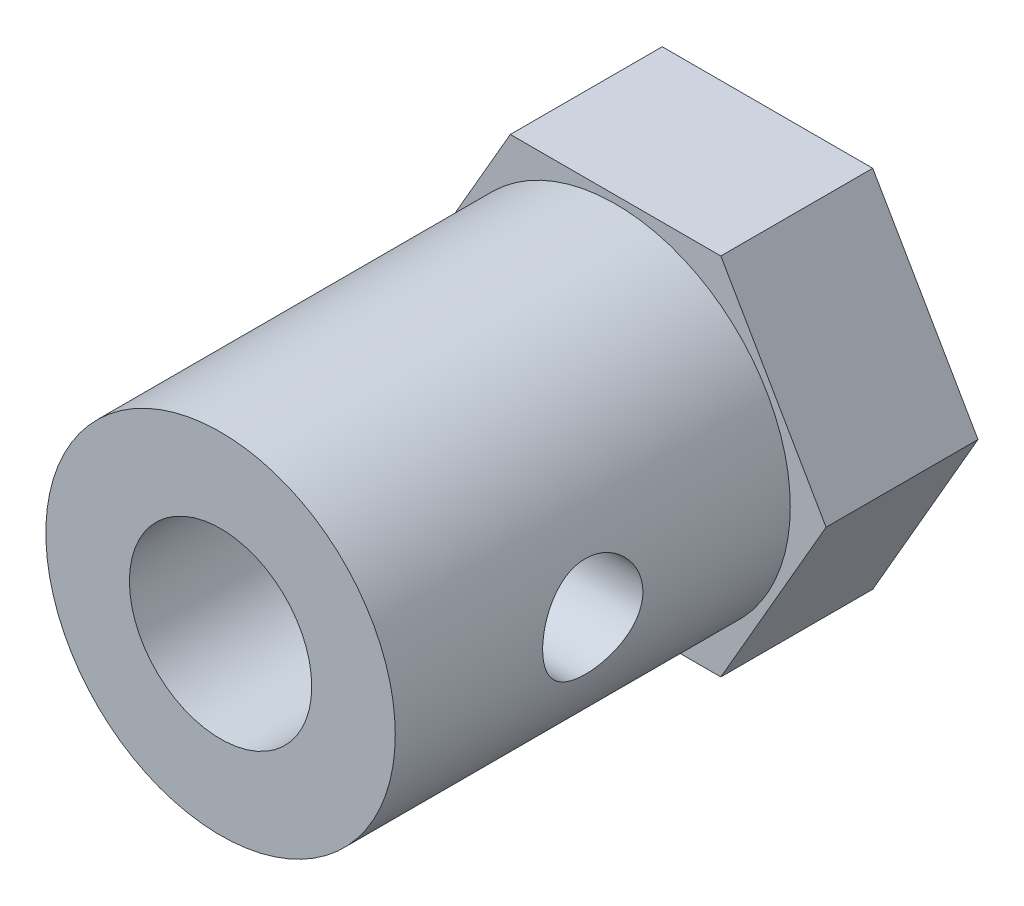
ISO-10303-21;
HEADER;
FILE_DESCRIPTION(('STEP AP214'),'2;1');
FILE_NAME('part.step','',(''),(''),'','','');
FILE_SCHEMA(('AUTOMOTIVE_DESIGN { 1 0 10303 214 1 1 1 1 }'));
ENDSEC;
DATA;
#1=APPLICATION_CONTEXT('core data for automotive mechanical design processes');
#2=APPLICATION_PROTOCOL_DEFINITION('international standard','automotive_design',2000,#1);
#3=PRODUCT_CONTEXT('',#1,'mechanical');
#4=PRODUCT('Part','Part','',(#3));
#5=PRODUCT_RELATED_PRODUCT_CATEGORY('part','',(#4));
#6=PRODUCT_DEFINITION_FORMATION('','',#4);
#7=PRODUCT_DEFINITION_CONTEXT('part definition',#1,'design');
#8=PRODUCT_DEFINITION('design','',#6,#7);
#9=PRODUCT_DEFINITION_SHAPE('','',#8);
#10=(LENGTH_UNIT() NAMED_UNIT(*) SI_UNIT(.MILLI.,.METRE.));
#11=(NAMED_UNIT(*) PLANE_ANGLE_UNIT() SI_UNIT($,.RADIAN.));
#12=(NAMED_UNIT(*) SI_UNIT($,.STERADIAN.) SOLID_ANGLE_UNIT());
#13=UNCERTAINTY_MEASURE_WITH_UNIT(LENGTH_MEASURE(1.E-05),#10,'distance_accuracy_value','');
#14=(GEOMETRIC_REPRESENTATION_CONTEXT(3) GLOBAL_UNCERTAINTY_ASSIGNED_CONTEXT((#13)) GLOBAL_UNIT_ASSIGNED_CONTEXT((#10,
#11,#12)) REPRESENTATION_CONTEXT('',''));
#15=CARTESIAN_POINT('',(0.,0.,0.));
#16=DIRECTION('',(0.,0.,1.));
#17=DIRECTION('',(1.,0.,0.));
#18=AXIS2_PLACEMENT_3D('',#15,#16,#17);
#19=CARTESIAN_POINT('',(0.,0.,18.));
#20=DIRECTION('',(0.,0.,-1.));
#21=DIRECTION('',(-1.,0.,0.));
#22=AXIS2_PLACEMENT_3D('',#19,#20,#21);
#23=CYLINDRICAL_SURFACE('',#22,5.75);
#24=CARTESIAN_POINT('',(0.,0.,18.));
#25=DIRECTION('',(0.,0.,1.));
#26=DIRECTION('',(1.,0.,0.));
#27=AXIS2_PLACEMENT_3D('',#24,#25,#26);
#28=CIRCLE('',#27,5.75);
#29=CARTESIAN_POINT('',(5.75,0.,18.));
#30=VERTEX_POINT('',#29);
#31=EDGE_CURVE('E220',#30,#30,#28,.T.);
#32=ORIENTED_EDGE('',*,*,#31,.F.);
#33=EDGE_LOOP('',(#32));
#34=FACE_BOUND('',#33,.T.);
#35=CARTESIAN_POINT('',(0.,0.,5.));
#36=DIRECTION('',(0.,0.,1.));
#37=DIRECTION('',(1.,0.,0.));
#38=AXIS2_PLACEMENT_3D('',#35,#36,#37);
#39=CIRCLE('',#38,5.75);
#40=CARTESIAN_POINT('',(5.75,0.,5.));
#41=VERTEX_POINT('',#40);
#42=EDGE_CURVE('E11',#41,#41,#39,.T.);
#43=ORIENTED_EDGE('',*,*,#42,.T.);
#44=EDGE_LOOP('',(#43));
#45=FACE_BOUND('',#44,.T.);
#46=CARTESIAN_POINT('',(5.75,0.,13.15));
#47=CARTESIAN_POINT('',(5.74999894485586,-0.0906961446381819,13.1499984405625));
#48=CARTESIAN_POINT('',(5.7478333791731,-0.181408288549587,13.1424970899451));
#49=CARTESIAN_POINT('',(5.73940553693281,-0.360202358944356,13.1127537315581));
#50=CARTESIAN_POINT('',(5.73314173825162,-0.448283295456844,13.0905062468906));
#51=CARTESIAN_POINT('',(5.71720581243595,-0.619209546256528,13.0320662575807));
#52=CARTESIAN_POINT('',(5.70753846268217,-0.702062008228269,12.9958932927651));
#53=CARTESIAN_POINT('',(5.68580699621906,-0.86052535142575,12.9107062228644));
#54=CARTESIAN_POINT('',(5.67374262283993,-0.936135455864288,12.8616907424422));
#55=CARTESIAN_POINT('',(5.64815284445102,-1.07997125627182,12.7508402700159));
#56=CARTESIAN_POINT('',(5.63459945629327,-1.14797782499046,12.6887274134066));
#57=CARTESIAN_POINT('',(5.60773116392039,-1.2727663228433,12.5540382389217));
#58=CARTESIAN_POINT('',(5.59441629610124,-1.3295465519892,12.4814603392129));
#59=CARTESIAN_POINT('',(5.56924061927724,-1.43138911178981,12.3260898327616));
#60=CARTESIAN_POINT('',(5.55741480657287,-1.47619022690635,12.2431198053084));
#61=CARTESIAN_POINT('',(5.53697172829493,-1.55111673219442,12.0704298045356));
#62=CARTESIAN_POINT('',(5.5283537658123,-1.58124531043008,11.980711302427));
#63=CARTESIAN_POINT('',(5.51559267171438,-1.62519308311781,11.7995186717094));
#64=CARTESIAN_POINT('',(5.51133965574286,-1.63941362793417,11.7081498282951));
#65=CARTESIAN_POINT('',(5.50746251461453,-1.6523941928162,11.5242319114202));
#66=CARTESIAN_POINT('',(5.50783737395267,-1.6511576046744,11.4316831013349));
#67=CARTESIAN_POINT('',(5.51307584933829,-1.63357560770256,11.2512419023816));
#68=CARTESIAN_POINT('',(5.51779218531269,-1.61772590568747,11.1632962400759));
#69=CARTESIAN_POINT('',(5.53094492411859,-1.57216567611317,10.9913685029092));
#70=CARTESIAN_POINT('',(5.53938166587569,-1.54245388571593,10.9073867899322));
#71=CARTESIAN_POINT('',(5.55914691967904,-1.46963231247883,10.7445263968793));
#72=CARTESIAN_POINT('',(5.57051092684131,-1.42635655158543,10.6657264233927));
#73=CARTESIAN_POINT('',(5.59483240379385,-1.32775098223681,10.5163374683174));
#74=CARTESIAN_POINT('',(5.60779023075596,-1.27241846973636,10.4457503341314));
#75=CARTESIAN_POINT('',(5.63444304543033,-1.14877872986672,10.3119705726714));
#76=CARTESIAN_POINT('',(5.64814732630681,-1.08005808628069,10.2491612679456));
#77=CARTESIAN_POINT('',(5.67431013521396,-0.932889263263325,10.135873537644));
#78=CARTESIAN_POINT('',(5.68676859753998,-0.854440571261456,10.0853957622327));
#79=CARTESIAN_POINT('',(5.70913392660977,-0.689387714677584,9.99799756735523));
#80=CARTESIAN_POINT('',(5.71902589074793,-0.602739737447879,9.96115582209669));
#81=CARTESIAN_POINT('',(5.73503628097883,-0.424129180421753,9.90267769185267));
#82=CARTESIAN_POINT('',(5.74115566675719,-0.332167958748287,9.88103743964685));
#83=CARTESIAN_POINT('',(5.74878229269431,-0.148805120715148,9.85420000916309));
#84=CARTESIAN_POINT('',(5.75043537624892,-0.0574855851111882,9.84848268174512));
#85=CARTESIAN_POINT('',(5.74936754798713,0.124810947541473,9.85220416305477));
#86=CARTESIAN_POINT('',(5.7466471659855,0.215787984743228,9.86164113594473));
#87=CARTESIAN_POINT('',(5.7372330855778,0.392896948063371,9.89498007817756));
#88=CARTESIAN_POINT('',(5.73062139395372,0.479089803046606,9.91858369234823));
#89=CARTESIAN_POINT('',(5.71418299265245,0.646277939031781,9.97923200530588));
#90=CARTESIAN_POINT('',(5.70435590980621,0.72727261544237,10.016278264262));
#91=CARTESIAN_POINT('',(5.68224574402977,0.88372270661621,10.1036700289363));
#92=CARTESIAN_POINT('',(5.66991383217279,0.95901905985284,10.1542876123503));
#93=CARTESIAN_POINT('',(5.6442144676031,1.10022857486026,10.2670501025528));
#94=CARTESIAN_POINT('',(5.63084677766897,1.16613957726298,10.3291976545898));
#95=CARTESIAN_POINT('',(5.60403174928982,1.28895901420806,10.4656947166757));
#96=CARTESIAN_POINT('',(5.59059635182993,1.34549838779868,10.5403793334319));
#97=CARTESIAN_POINT('',(5.56564246336,1.44526055924657,10.6984663577108));
#98=CARTESIAN_POINT('',(5.55412390685278,1.48848381214969,10.7818684672039));
#99=CARTESIAN_POINT('',(5.53444235202912,1.56007293905557,10.9546830720141));
#100=CARTESIAN_POINT('',(5.52626177491665,1.5885168680396,11.0440611180019));
#101=CARTESIAN_POINT('',(5.51420547135784,1.62988071124704,11.2266124631843));
#102=CARTESIAN_POINT('',(5.5103284262893,1.64280538074285,11.3197845907787));
#103=CARTESIAN_POINT('',(5.5074402742898,1.65245987251955,11.5034685465837));
#104=CARTESIAN_POINT('',(5.50824947335189,1.64978772302246,11.5939465508489));
#105=CARTESIAN_POINT('',(5.51421515076883,1.62973566438414,11.7731043332403));
#106=CARTESIAN_POINT('',(5.51937148168594,1.61235625405569,11.8617841722488));
#107=CARTESIAN_POINT('',(5.53333519378014,1.56375384907016,12.0339420216163));
#108=CARTESIAN_POINT('',(5.54210412419185,1.53267641313955,12.1174644697843));
#109=CARTESIAN_POINT('',(5.56230093904094,1.45767276307374,12.2781758153731));
#110=CARTESIAN_POINT('',(5.57372929738854,1.41374425851812,12.355363580633));
#111=CARTESIAN_POINT('',(5.59843739640016,1.31255246555541,12.5040220733673));
#112=CARTESIAN_POINT('',(5.61176649295712,1.25489022721241,12.5752130466321));
#113=CARTESIAN_POINT('',(5.63852078233132,1.12860221455032,12.7071023963313));
#114=CARTESIAN_POINT('',(5.65194599855773,1.05997367626547,12.7677981194728));
#115=CARTESIAN_POINT('',(5.67779722780504,0.91155408964373,12.8785359123087));
#116=CARTESIAN_POINT('',(5.69018826682081,0.831519570391585,12.9282606136112));
#117=CARTESIAN_POINT('',(5.71217142304035,0.663871191007069,13.0134746702933));
#118=CARTESIAN_POINT('',(5.72176505050729,0.576261453823037,13.0489717107773));
#119=CARTESIAN_POINT('',(5.73606952160004,0.40769083978903,13.1009467332427));
#120=CARTESIAN_POINT('',(5.74125239799259,0.327342194635824,13.1192948467815));
#121=CARTESIAN_POINT('',(5.7482178842134,0.164666580993481,13.1438213579009));
#122=CARTESIAN_POINT('',(5.75000095792876,0.0823398839526751,13.1500014157592));
#123=CARTESIAN_POINT('',(5.75,0.,13.15));
#124=B_SPLINE_CURVE_WITH_KNOTS('',3,(#46,#47,#48,#49,#50,#51,#52,#53,#54,#55,#56,#57,#58,#59,
#60,#61,#62,#63,#64,#65,#66,#67,#68,#69,#70,#71,#72,#73,#74,#75,#76,#77,#78,#79,#80,#81,#82,#83,
#84,#85,#86,#87,#88,#89,#90,#91,#92,#93,#94,#95,#96,#97,#98,#99,#100,#101,#102,#103,#104,#105,
#106,#107,#108,#109,#110,#111,#112,#113,#114,#115,#116,#117,#118,#119,#120,#121,#122,#123),
.UNSPECIFIED.,.T.,.F.,(4,2,2,2,2,2,2,2,2,2,2,2,2,2,2,2,2,2,2,2,2,2,2,2,2,2,2,2,2,2,2,2,2,2,2,2,
2,2,4),(0.,0.271786181811191,0.543673365004665,0.815180426461545,1.08671657618187,
1.36472887245395,1.64278323553499,1.92648098453513,2.21011706385886,2.48642335418865,
2.76266901508852,3.02987551217674,3.29710635656585,3.56774404904759,3.83844250177548,
4.11943605412332,4.40044441830765,4.68304970328904,4.96558306815811,5.23877224528155,
5.51192832994056,5.77952413512242,6.04715100772602,6.32060664877917,6.59412510480543,
6.87667374860184,7.15921273591808,7.44024396372968,7.72118905847898,7.991434465033,
8.26167070628679,8.52910208965749,8.79658116586061,9.07306028653828,9.34960920173971,
9.63333523109917,9.91690779797436,10.1636867198652,10.4104319675221),.UNSPECIFIED.);
#125=CARTESIAN_POINT('',(5.75,0.,13.15));
#126=VERTEX_POINT('',#125);
#127=EDGE_CURVE('E164',#126,#126,#124,.T.);
#128=ORIENTED_EDGE('',*,*,#127,.F.);
#129=EDGE_LOOP('',(#128));
#130=FACE_BOUND('',#129,.T.);
#131=CARTESIAN_POINT('',(-5.75,0.,13.15));
#132=CARTESIAN_POINT('',(-5.74999894485586,0.0906961446381819,13.1499984405625));
#133=CARTESIAN_POINT('',(-5.7478333791731,0.181408288549587,13.1424970899451));
#134=CARTESIAN_POINT('',(-5.73940553693281,0.360202358944356,13.1127537315581));
#135=CARTESIAN_POINT('',(-5.73314173825162,0.448283295456844,13.0905062468906));
#136=CARTESIAN_POINT('',(-5.71720581243595,0.619209546256528,13.0320662575807));
#137=CARTESIAN_POINT('',(-5.70753846268218,0.702062008228269,12.9958932927651));
#138=CARTESIAN_POINT('',(-5.68580699621906,0.86052535142575,12.9107062228644));
#139=CARTESIAN_POINT('',(-5.67374262283993,0.936135455864288,12.8616907424422));
#140=CARTESIAN_POINT('',(-5.64815284445101,1.07997125627182,12.7508402700159));
#141=CARTESIAN_POINT('',(-5.63459945629327,1.14797782499046,12.6887274134066));
#142=CARTESIAN_POINT('',(-5.60773116392039,1.2727663228433,12.5540382389217));
#143=CARTESIAN_POINT('',(-5.59441629610124,1.3295465519892,12.4814603392129));
#144=CARTESIAN_POINT('',(-5.56924061927724,1.43138911178981,12.3260898327616));
#145=CARTESIAN_POINT('',(-5.55741480657287,1.47619022690635,12.2431198053084));
#146=CARTESIAN_POINT('',(-5.53697172829493,1.55111673219442,12.0704298045356));
#147=CARTESIAN_POINT('',(-5.5283537658123,1.58124531043008,11.980711302427));
#148=CARTESIAN_POINT('',(-5.51559267171438,1.62519308311781,11.7995186717094));
#149=CARTESIAN_POINT('',(-5.51133965574286,1.63941362793417,11.7081498282951));
#150=CARTESIAN_POINT('',(-5.50746251461453,1.65239419281619,11.5242319114202));
#151=CARTESIAN_POINT('',(-5.50783737395267,1.6511576046744,11.4316831013349));
#152=CARTESIAN_POINT('',(-5.51307584933829,1.63357560770256,11.2512419023816));
#153=CARTESIAN_POINT('',(-5.51779218531269,1.61772590568747,11.1632962400759));
#154=CARTESIAN_POINT('',(-5.53094492411859,1.57216567611317,10.9913685029092));
#155=CARTESIAN_POINT('',(-5.53938166587569,1.54245388571593,10.9073867899322));
#156=CARTESIAN_POINT('',(-5.55914691967904,1.46963231247883,10.7445263968793));
#157=CARTESIAN_POINT('',(-5.57051092684131,1.42635655158543,10.6657264233927));
#158=CARTESIAN_POINT('',(-5.59483240379385,1.32775098223681,10.5163374683174));
#159=CARTESIAN_POINT('',(-5.60779023075596,1.27241846973636,10.4457503341314));
#160=CARTESIAN_POINT('',(-5.63444304543033,1.14877872986672,10.3119705726714));
#161=CARTESIAN_POINT('',(-5.64814732630681,1.08005808628069,10.2491612679456));
#162=CARTESIAN_POINT('',(-5.67431013521396,0.932889263263325,10.135873537644));
#163=CARTESIAN_POINT('',(-5.68676859753998,0.854440571261455,10.0853957622327));
#164=CARTESIAN_POINT('',(-5.70913392660977,0.689387714677585,9.99799756735523));
#165=CARTESIAN_POINT('',(-5.71902589074793,0.60273973744788,9.96115582209669));
#166=CARTESIAN_POINT('',(-5.73503628097883,0.424129180421754,9.90267769185267));
#167=CARTESIAN_POINT('',(-5.74115566675719,0.332167958748289,9.88103743964685));
#168=CARTESIAN_POINT('',(-5.74878229269431,0.148805120715149,9.85420000916309));
#169=CARTESIAN_POINT('',(-5.75043537624892,0.0574855851111898,9.84848268174512));
#170=CARTESIAN_POINT('',(-5.74936754798713,-0.124810947541471,9.85220416305477));
#171=CARTESIAN_POINT('',(-5.7466471659855,-0.215787984743227,9.86164113594473));
#172=CARTESIAN_POINT('',(-5.7372330855778,-0.39289694806337,9.89498007817756));
#173=CARTESIAN_POINT('',(-5.73062139395372,-0.479089803046605,9.91858369234823));
#174=CARTESIAN_POINT('',(-5.71418299265245,-0.646277939031781,9.97923200530588));
#175=CARTESIAN_POINT('',(-5.70435590980621,-0.72727261544237,10.016278264262));
#176=CARTESIAN_POINT('',(-5.68224574402977,-0.883722706616209,10.1036700289363));
#177=CARTESIAN_POINT('',(-5.66991383217279,-0.959019059852839,10.1542876123503));
#178=CARTESIAN_POINT('',(-5.6442144676031,-1.10022857486026,10.2670501025528));
#179=CARTESIAN_POINT('',(-5.63084677766897,-1.16613957726298,10.3291976545898));
#180=CARTESIAN_POINT('',(-5.60403174928982,-1.28895901420806,10.4656947166757));
#181=CARTESIAN_POINT('',(-5.59059635182993,-1.34549838779868,10.5403793334319));
#182=CARTESIAN_POINT('',(-5.56564246336,-1.44526055924657,10.6984663577108));
#183=CARTESIAN_POINT('',(-5.55412390685278,-1.48848381214969,10.7818684672039));
#184=CARTESIAN_POINT('',(-5.53444235202911,-1.56007293905557,10.9546830720141));
#185=CARTESIAN_POINT('',(-5.52626177491665,-1.5885168680396,11.0440611180019));
#186=CARTESIAN_POINT('',(-5.51420547135784,-1.62988071124704,11.2266124631843));
#187=CARTESIAN_POINT('',(-5.5103284262893,-1.64280538074285,11.3197845907787));
#188=CARTESIAN_POINT('',(-5.5074402742898,-1.65245987251955,11.5034685465837));
#189=CARTESIAN_POINT('',(-5.50824947335189,-1.64978772302246,11.5939465508489));
#190=CARTESIAN_POINT('',(-5.51421515076883,-1.62973566438414,11.7731043332403));
#191=CARTESIAN_POINT('',(-5.51937148168594,-1.61235625405569,11.8617841722488));
#192=CARTESIAN_POINT('',(-5.53333519378014,-1.56375384907016,12.0339420216163));
#193=CARTESIAN_POINT('',(-5.54210412419185,-1.53267641313955,12.1174644697843));
#194=CARTESIAN_POINT('',(-5.56230093904094,-1.45767276307374,12.2781758153731));
#195=CARTESIAN_POINT('',(-5.57372929738854,-1.41374425851812,12.355363580633));
#196=CARTESIAN_POINT('',(-5.59843739640016,-1.31255246555541,12.5040220733673));
#197=CARTESIAN_POINT('',(-5.61176649295712,-1.25489022721241,12.5752130466321));
#198=CARTESIAN_POINT('',(-5.63852078233132,-1.12860221455032,12.7071023963313));
#199=CARTESIAN_POINT('',(-5.65194599855773,-1.05997367626547,12.7677981194728));
#200=CARTESIAN_POINT('',(-5.67779722780504,-0.91155408964373,12.8785359123087));
#201=CARTESIAN_POINT('',(-5.69018826682081,-0.831519570391585,12.9282606136112));
#202=CARTESIAN_POINT('',(-5.71217142304035,-0.663871191007069,13.0134746702933));
#203=CARTESIAN_POINT('',(-5.72176505050729,-0.576261453823037,13.0489717107773));
#204=CARTESIAN_POINT('',(-5.73606952160004,-0.40769083978903,13.1009467332427));
#205=CARTESIAN_POINT('',(-5.74125239799258,-0.327342194635824,13.1192948467815));
#206=CARTESIAN_POINT('',(-5.7482178842134,-0.164666580993481,13.1438213579009));
#207=CARTESIAN_POINT('',(-5.75000095792876,-0.0823398839526751,13.1500014157592));
#208=CARTESIAN_POINT('',(-5.75,0.,13.15));
#209=B_SPLINE_CURVE_WITH_KNOTS('',3,(#131,#132,#133,#134,#135,#136,#137,#138,#139,#140,#141,
#142,#143,#144,#145,#146,#147,#148,#149,#150,#151,#152,#153,#154,#155,#156,#157,#158,#159,#160,
#161,#162,#163,#164,#165,#166,#167,#168,#169,#170,#171,#172,#173,#174,#175,#176,#177,#178,#179,
#180,#181,#182,#183,#184,#185,#186,#187,#188,#189,#190,#191,#192,#193,#194,#195,#196,#197,#198,
#199,#200,#201,#202,#203,#204,#205,#206,#207,#208),.UNSPECIFIED.,.T.,.F.,(4,2,2,2,2,2,2,2,2,2,2,
2,2,2,2,2,2,2,2,2,2,2,2,2,2,2,2,2,2,2,2,2,2,2,2,2,2,2,4),(0.,0.271786181811191,
0.543673365004665,0.815180426461545,1.08671657618187,1.36472887245394,1.64278323553499,
1.92648098453513,2.21011706385886,2.48642335418865,2.76266901508852,3.02987551217674,
3.29710635656585,3.56774404904759,3.83844250177548,4.11943605412332,4.40044441830765,
4.68304970328904,4.96558306815811,5.23877224528154,5.51192832994056,5.77952413512242,
6.04715100772602,6.32060664877917,6.59412510480542,6.87667374860184,7.15921273591808,
7.44024396372968,7.72118905847898,7.991434465033,8.26167070628679,8.52910208965749,
8.79658116586061,9.07306028653828,9.34960920173971,9.63333523109917,9.91690779797435,
10.1636867198652,10.4104319675221),.UNSPECIFIED.);
#210=CARTESIAN_POINT('',(-5.75,0.,13.15));
#211=VERTEX_POINT('',#210);
#212=EDGE_CURVE('E170',#211,#211,#209,.T.);
#213=ORIENTED_EDGE('',*,*,#212,.F.);
#214=EDGE_LOOP('',(#213));
#215=FACE_BOUND('',#214,.T.);
#216=ADVANCED_FACE('F35',(#34,#45,#130,#215),#23,.T.);
#217=CARTESIAN_POINT('',(0.,0.,18.));
#218=DIRECTION('',(0.,0.,-1.));
#219=DIRECTION('',(-1.,0.,0.));
#220=AXIS2_PLACEMENT_3D('',#217,#218,#219);
#221=CYLINDRICAL_SURFACE('',#220,3.);
#222=CARTESIAN_POINT('',(3.,0.,13.15));
#223=CARTESIAN_POINT('',(2.99999513886583,-0.0856699475452995,13.1499946166217));
#224=CARTESIAN_POINT('',(2.99629302255545,-0.171409071205646,13.143289354409));
#225=CARTESIAN_POINT('',(2.9818478399119,-0.340286051726047,13.1167977847696));
#226=CARTESIAN_POINT('',(2.97109516282085,-0.423420195379861,13.096993621652));
#227=CARTESIAN_POINT('',(2.9436571869529,-0.584401577928637,13.0453455356783));
#228=CARTESIAN_POINT('',(2.9269963495649,-0.662269062667419,13.0135512213703));
#229=CARTESIAN_POINT('',(2.8892116252981,-0.811408240635763,12.9391213318261));
#230=CARTESIAN_POINT('',(2.86808754775153,-0.882679651896674,12.8964852934199));
#231=CARTESIAN_POINT('',(2.82153252993505,-1.02211619357275,12.7982846668754));
#232=CARTESIAN_POINT('',(2.79590528013301,-1.08973037342791,12.7420324755559));
#233=CARTESIAN_POINT('',(2.74375354722835,-1.21508634233517,12.6197083915399));
#234=CARTESIAN_POINT('',(2.71722825277821,-1.2728189023456,12.5536274256305));
#235=CARTESIAN_POINT('',(2.66321895829991,-1.38251917690996,12.4057740140773));
#236=CARTESIAN_POINT('',(2.635897965792,-1.43335857713386,12.3230970385153));
#237=CARTESIAN_POINT('',(2.58678336476683,-1.52021547735939,12.1487726343674));
#238=CARTESIAN_POINT('',(2.56498539395023,-1.5562446891168,12.0571323651428));
#239=CARTESIAN_POINT('',(2.53163475086558,-1.60989890926138,11.8732305515727));
#240=CARTESIAN_POINT('',(2.51952192354843,-1.62854263347079,11.7813738465472));
#241=CARTESIAN_POINT('',(2.5055890563389,-1.64991120631134,11.5951105514433));
#242=CARTESIAN_POINT('',(2.50375425894471,-1.65265887915297,11.500707812976));
#243=CARTESIAN_POINT('',(2.51015646726158,-1.64290000078864,11.3275716432504));
#244=CARTESIAN_POINT('',(2.51690299364892,-1.63265157443424,11.2486402415007));
#245=CARTESIAN_POINT('',(2.53703527550373,-1.60118639026894,11.0938705800967));
#246=CARTESIAN_POINT('',(2.55042405491467,-1.5799646365691,11.0180337463059));
#247=CARTESIAN_POINT('',(2.58256130946142,-1.52687641342515,10.8695176799991));
#248=CARTESIAN_POINT('',(2.60141910516922,-1.49479033069661,10.7969417622077));
#249=CARTESIAN_POINT('',(2.64240902469132,-1.42107429999088,10.6578289794032));
#250=CARTESIAN_POINT('',(2.66454256035721,-1.37944023253661,10.5912947384181));
#251=CARTESIAN_POINT('',(2.71379040847906,-1.28018349411555,10.4551052164199));
#252=CARTESIAN_POINT('',(2.74113957142577,-1.22107458392543,10.3866139481156));
#253=CARTESIAN_POINT('',(2.79497377887706,-1.09224532196501,10.2599734193486));
#254=CARTESIAN_POINT('',(2.82145822218593,-1.02251777065964,10.2018312341076));
#255=CARTESIAN_POINT('',(2.87272134052732,-0.868605041800936,10.0937851733166));
#256=CARTESIAN_POINT('',(2.89726648156192,-0.783763861453043,10.0446953593711));
#257=CARTESIAN_POINT('',(2.93971528365153,-0.605352377645233,9.96191924656253));
#258=CARTESIAN_POINT('',(2.95762518579738,-0.511790381195994,9.92821846583331));
#259=CARTESIAN_POINT('',(2.98333345624201,-0.327907037980979,9.88038778956176));
#260=CARTESIAN_POINT('',(2.99191822782612,-0.238095480523289,9.86472744848248));
#261=CARTESIAN_POINT('',(3.00083376662002,-0.0567325334425141,9.84846917129306));
#262=CARTESIAN_POINT('',(3.00116980828416,0.0348177069344338,9.84786161003821));
#263=CARTESIAN_POINT('',(2.99394177831786,0.207487375150857,9.86103451330555));
#264=CARTESIAN_POINT('',(2.98714659587173,0.288751776237439,9.87341460128179));
#265=CARTESIAN_POINT('',(2.96746793830126,0.447838849624848,9.90984259733264));
#266=CARTESIAN_POINT('',(2.95458384737082,0.52566117293791,9.93389168556646));
#267=CARTESIAN_POINT('',(2.92349378037744,0.677753407865903,9.99335761595169));
#268=CARTESIAN_POINT('',(2.90517475144826,0.751904240945377,10.0290176955469));
#269=CARTESIAN_POINT('',(2.86484215103297,0.893363199749703,10.1103713462997));
#270=CARTESIAN_POINT('',(2.8428272299655,0.960668811424107,10.1560685844836));
#271=CARTESIAN_POINT('',(2.79420331593949,1.09455456288909,10.2620447141384));
#272=CARTESIAN_POINT('',(2.76735592347542,1.16021004375818,10.323383283659));
#273=CARTESIAN_POINT('',(2.71365440736755,1.28079913012788,10.4559244296775));
#274=CARTESIAN_POINT('',(2.6868003055646,1.33572155748717,10.5271371592824));
#275=CARTESIAN_POINT('',(2.63385875511374,1.43747254066661,10.6841641934071));
#276=CARTESIAN_POINT('',(2.60799295737883,1.48334076829298,10.7706830768754));
#277=CARTESIAN_POINT('',(2.56323063992907,1.55942876653783,10.9519940797087));
#278=CARTESIAN_POINT('',(2.54432398053561,1.58967133039468,11.0467739113999));
#279=CARTESIAN_POINT('',(2.51825420457375,1.6306246255404,11.2322623775855));
#280=CARTESIAN_POINT('',(2.51013022153208,1.64294477567078,11.3224747805395));
#281=CARTESIAN_POINT('',(2.50386093509844,1.6524903491229,11.504010469288));
#282=CARTESIAN_POINT('',(2.50570706604924,1.64972872967261,11.5953327342726));
#283=CARTESIAN_POINT('',(2.51807870697285,1.63075691736925,11.7632195215555));
#284=CARTESIAN_POINT('',(2.52738874118223,1.61642825416935,11.8401009735331));
#285=CARTESIAN_POINT('',(2.55192145753237,1.57741079979876,11.99019541896));
#286=CARTESIAN_POINT('',(2.56714656833463,1.55271775279779,12.0634068916));
#287=CARTESIAN_POINT('',(2.60289749299613,1.492056117962,12.209139646293));
#288=CARTESIAN_POINT('',(2.62369085726804,1.45548954002739,12.2813439958992));
#289=CARTESIAN_POINT('',(2.66794671801683,1.37268509596929,12.4190760215003));
#290=CARTESIAN_POINT('',(2.69141062791391,1.32644209751913,12.4846001267867));
#291=CARTESIAN_POINT('',(2.74276036037727,1.21715006880685,12.6178497395553));
#292=CARTESIAN_POINT('',(2.770762457364,1.15260264369497,12.6843082351833));
#293=CARTESIAN_POINT('',(2.82486614857147,1.01279351012944,12.8058844274221));
#294=CARTESIAN_POINT('',(2.85096636964491,0.937524174112386,12.860993981549));
#295=CARTESIAN_POINT('',(2.89948189270181,0.774887264813826,12.9599380339659));
#296=CARTESIAN_POINT('',(2.92173740350452,0.68718989241559,13.0033135644064));
#297=CARTESIAN_POINT('',(2.95878417900051,0.504223640414895,13.0741097143307));
#298=CARTESIAN_POINT('',(2.97359457153256,0.408974898948851,13.1015712477707));
#299=CARTESIAN_POINT('',(2.98911434756595,0.260510618519073,13.1301420580123));
#300=CARTESIAN_POINT('',(2.99318008334623,0.208783056433922,13.1375724320123));
#301=CARTESIAN_POINT('',(2.99862437594613,0.104712273399593,13.1475030128209));
#302=CARTESIAN_POINT('',(3.00000297155585,0.0523690613485743,13.1500032907977));
#303=CARTESIAN_POINT('',(3.,0.,13.15));
#304=B_SPLINE_CURVE_WITH_KNOTS('',3,(#222,#223,#224,#225,#226,#227,#228,#229,#230,#231,#232,
#233,#234,#235,#236,#237,#238,#239,#240,#241,#242,#243,#244,#245,#246,#247,#248,#249,#250,#251,
#252,#253,#254,#255,#256,#257,#258,#259,#260,#261,#262,#263,#264,#265,#266,#267,#268,#269,#270,
#271,#272,#273,#274,#275,#276,#277,#278,#279,#280,#281,#282,#283,#284,#285,#286,#287,#288,#289,
#290,#291,#292,#293,#294,#295,#296,#297,#298,#299,#300,#301,#302,#303),.UNSPECIFIED.,.T.,.F.,(4,
2,2,2,2,2,2,2,2,2,2,2,2,2,2,2,2,2,2,2,2,2,2,2,2,2,2,2,2,2,2,2,2,2,2,2,2,2,2,2,4),(0.,
0.256799016537927,0.513948810602823,0.770046131883809,1.02615439574975,1.29988051794781,
1.57386091081864,1.87483382859252,2.17556827984511,2.45730761481344,2.7386423161532,
2.97715628850378,3.21577894619804,3.45954576386221,3.70341795322454,3.98576982265922,
4.26831398861797,4.56980790280871,4.87101750814851,5.14417314031287,5.41715410504554,
5.66345591892143,5.90978264803878,6.16164305576709,6.41359563296034,6.69375293580822,
6.97420047673716,7.27643629132654,7.57822997932258,7.85076329691248,8.12306250931443,
8.35830132419629,8.59363682764366,8.84338665158086,9.09326927891542,9.38234984684169,
9.67163710326651,9.97098879991469,10.2695674268337,10.4265480013941,10.5835263098519),.UNSPECIFIED.);
#305=CARTESIAN_POINT('',(3.,0.,13.15));
#306=VERTEX_POINT('',#305);
#307=EDGE_CURVE('E146',#306,#306,#304,.T.);
#308=ORIENTED_EDGE('',*,*,#307,.T.);
#309=EDGE_LOOP('',(#308));
#310=FACE_BOUND('',#309,.T.);
#311=CARTESIAN_POINT('',(0.,0.,18.));
#312=DIRECTION('',(0.,0.,1.));
#313=DIRECTION('',(1.,0.,0.));
#314=AXIS2_PLACEMENT_3D('',#311,#312,#313);
#315=CIRCLE('',#314,3.);
#316=CARTESIAN_POINT('',(3.,0.,18.));
#317=VERTEX_POINT('',#316);
#318=EDGE_CURVE('E225',#317,#317,#315,.T.);
#319=ORIENTED_EDGE('',*,*,#318,.T.);
#320=EDGE_LOOP('',(#319));
#321=FACE_BOUND('',#320,.T.);
#322=CARTESIAN_POINT('',(0.,0.,5.));
#323=DIRECTION('',(0.,0.,1.));
#324=DIRECTION('',(1.,0.,0.));
#325=AXIS2_PLACEMENT_3D('',#322,#323,#324);
#326=CIRCLE('',#325,3.);
#327=CARTESIAN_POINT('',(3.,0.,5.));
#328=VERTEX_POINT('',#327);
#329=EDGE_CURVE('E226',#328,#328,#326,.T.);
#330=ORIENTED_EDGE('',*,*,#329,.F.);
#331=EDGE_LOOP('',(#330));
#332=FACE_BOUND('',#331,.T.);
#333=CARTESIAN_POINT('',(-3.,0.,13.15));
#334=CARTESIAN_POINT('',(-2.99999513886583,0.0856699475452997,13.1499946166217));
#335=CARTESIAN_POINT('',(-2.99629302255545,0.171409071205647,13.143289354409));
#336=CARTESIAN_POINT('',(-2.9818478399119,0.340286051726048,13.1167977847696));
#337=CARTESIAN_POINT('',(-2.97109516282085,0.423420195379861,13.096993621652));
#338=CARTESIAN_POINT('',(-2.9436571869529,0.584401577928638,13.0453455356783));
#339=CARTESIAN_POINT('',(-2.92699634956489,0.66226906266742,13.0135512213703));
#340=CARTESIAN_POINT('',(-2.8892116252981,0.811408240635765,12.9391213318261));
#341=CARTESIAN_POINT('',(-2.86808754775153,0.882679651896675,12.8964852934199));
#342=CARTESIAN_POINT('',(-2.82153252993505,1.02211619357275,12.7982846668754));
#343=CARTESIAN_POINT('',(-2.79590528013301,1.08973037342791,12.7420324755559));
#344=CARTESIAN_POINT('',(-2.74375354722835,1.21508634233517,12.6197083915399));
#345=CARTESIAN_POINT('',(-2.71722825277821,1.2728189023456,12.5536274256305));
#346=CARTESIAN_POINT('',(-2.66321895829991,1.38251917690996,12.4057740140773));
#347=CARTESIAN_POINT('',(-2.635897965792,1.43335857713387,12.3230970385153));
#348=CARTESIAN_POINT('',(-2.58678336476683,1.52021547735939,12.1487726343674));
#349=CARTESIAN_POINT('',(-2.56498539395023,1.5562446891168,12.0571323651427));
#350=CARTESIAN_POINT('',(-2.53163475086558,1.60989890926138,11.8732305515727));
#351=CARTESIAN_POINT('',(-2.51952192354843,1.62854263347079,11.7813738465472));
#352=CARTESIAN_POINT('',(-2.5055890563389,1.64991120631134,11.5951105514433));
#353=CARTESIAN_POINT('',(-2.50375425894471,1.65265887915297,11.500707812976));
#354=CARTESIAN_POINT('',(-2.51015646726158,1.64290000078864,11.3275716432504));
#355=CARTESIAN_POINT('',(-2.51690299364892,1.63265157443424,11.2486402415007));
#356=CARTESIAN_POINT('',(-2.53703527550373,1.60118639026894,11.0938705800967));
#357=CARTESIAN_POINT('',(-2.55042405491467,1.5799646365691,11.0180337463059));
#358=CARTESIAN_POINT('',(-2.58256130946142,1.52687641342515,10.8695176799991));
#359=CARTESIAN_POINT('',(-2.60141910516922,1.49479033069661,10.7969417622077));
#360=CARTESIAN_POINT('',(-2.64240902469132,1.42107429999088,10.6578289794032));
#361=CARTESIAN_POINT('',(-2.66454256035721,1.37944023253661,10.5912947384181));
#362=CARTESIAN_POINT('',(-2.71379040847906,1.28018349411555,10.4551052164199));
#363=CARTESIAN_POINT('',(-2.74113957142577,1.22107458392543,10.3866139481156));
#364=CARTESIAN_POINT('',(-2.79497377887706,1.09224532196501,10.2599734193486));
#365=CARTESIAN_POINT('',(-2.82145822218593,1.02251777065964,10.2018312341076));
#366=CARTESIAN_POINT('',(-2.87272134052732,0.868605041800936,10.0937851733166));
#367=CARTESIAN_POINT('',(-2.89726648156192,0.783763861453043,10.0446953593711));
#368=CARTESIAN_POINT('',(-2.93971528365153,0.605352377645233,9.96191924656253));
#369=CARTESIAN_POINT('',(-2.95762518579738,0.511790381195994,9.92821846583331));
#370=CARTESIAN_POINT('',(-2.98333345624201,0.327907037980978,9.88038778956176));
#371=CARTESIAN_POINT('',(-2.99191822782612,0.238095480523289,9.86472744848248));
#372=CARTESIAN_POINT('',(-3.00083376662002,0.056732533442514,9.84846917129306));
#373=CARTESIAN_POINT('',(-3.00116980828416,-0.0348177069344342,9.84786161003821));
#374=CARTESIAN_POINT('',(-2.99394177831786,-0.207487375150857,9.86103451330555));
#375=CARTESIAN_POINT('',(-2.98714659587173,-0.28875177623744,9.87341460128179));
#376=CARTESIAN_POINT('',(-2.96746793830126,-0.447838849624848,9.90984259733264));
#377=CARTESIAN_POINT('',(-2.95458384737082,-0.525661172937911,9.93389168556646));
#378=CARTESIAN_POINT('',(-2.92349378037743,-0.677753407865904,9.99335761595169));
#379=CARTESIAN_POINT('',(-2.90517475144826,-0.751904240945379,10.0290176955469));
#380=CARTESIAN_POINT('',(-2.86484215103297,-0.893363199749706,10.1103713462997));
#381=CARTESIAN_POINT('',(-2.8428272299655,-0.960668811424109,10.1560685844836));
#382=CARTESIAN_POINT('',(-2.79420331593949,-1.09455456288909,10.2620447141384));
#383=CARTESIAN_POINT('',(-2.76735592347542,-1.16021004375818,10.323383283659));
#384=CARTESIAN_POINT('',(-2.71365440736755,-1.28079913012788,10.4559244296775));
#385=CARTESIAN_POINT('',(-2.6868003055646,-1.33572155748717,10.5271371592824));
#386=CARTESIAN_POINT('',(-2.63385875511374,-1.43747254066661,10.6841641934071));
#387=CARTESIAN_POINT('',(-2.60799295737883,-1.48334076829298,10.7706830768754));
#388=CARTESIAN_POINT('',(-2.56323063992907,-1.55942876653783,10.9519940797087));
#389=CARTESIAN_POINT('',(-2.54432398053561,-1.58967133039468,11.0467739113999));
#390=CARTESIAN_POINT('',(-2.51825420457375,-1.6306246255404,11.2322623775855));
#391=CARTESIAN_POINT('',(-2.51013022153208,-1.64294477567078,11.3224747805395));
#392=CARTESIAN_POINT('',(-2.50386093509844,-1.6524903491229,11.504010469288));
#393=CARTESIAN_POINT('',(-2.50570706604924,-1.64972872967261,11.5953327342726));
#394=CARTESIAN_POINT('',(-2.51807870697285,-1.63075691736925,11.7632195215555));
#395=CARTESIAN_POINT('',(-2.52738874118223,-1.61642825416935,11.8401009735331));
#396=CARTESIAN_POINT('',(-2.55192145753237,-1.57741079979876,11.99019541896));
#397=CARTESIAN_POINT('',(-2.56714656833463,-1.55271775279779,12.0634068916));
#398=CARTESIAN_POINT('',(-2.60289749299613,-1.492056117962,12.209139646293));
#399=CARTESIAN_POINT('',(-2.62369085726804,-1.45548954002739,12.2813439958992));
#400=CARTESIAN_POINT('',(-2.66794671801683,-1.37268509596929,12.4190760215003));
#401=CARTESIAN_POINT('',(-2.69141062791391,-1.32644209751913,12.4846001267867));
#402=CARTESIAN_POINT('',(-2.74276036037727,-1.21715006880685,12.6178497395553));
#403=CARTESIAN_POINT('',(-2.77076245736401,-1.15260264369497,12.6843082351833));
#404=CARTESIAN_POINT('',(-2.82486614857147,-1.01279351012944,12.8058844274221));
#405=CARTESIAN_POINT('',(-2.85096636964491,-0.937524174112385,12.860993981549));
#406=CARTESIAN_POINT('',(-2.89948189270181,-0.774887264813826,12.9599380339659));
#407=CARTESIAN_POINT('',(-2.92173740350452,-0.68718989241559,13.0033135644064));
#408=CARTESIAN_POINT('',(-2.95878417900051,-0.504223640414895,13.0741097143307));
#409=CARTESIAN_POINT('',(-2.97359457153256,-0.408974898948851,13.1015712477707));
#410=CARTESIAN_POINT('',(-2.98911434756595,-0.260510618519073,13.1301420580123));
#411=CARTESIAN_POINT('',(-2.99318008334623,-0.208783056433922,13.1375724320123));
#412=CARTESIAN_POINT('',(-2.99862437594613,-0.104712273399592,13.1475030128209));
#413=CARTESIAN_POINT('',(-3.00000297155585,-0.0523690613485742,13.1500032907977));
#414=CARTESIAN_POINT('',(-3.,0.,13.15));
#415=B_SPLINE_CURVE_WITH_KNOTS('',3,(#333,#334,#335,#336,#337,#338,#339,#340,#341,#342,#343,
#344,#345,#346,#347,#348,#349,#350,#351,#352,#353,#354,#355,#356,#357,#358,#359,#360,#361,#362,
#363,#364,#365,#366,#367,#368,#369,#370,#371,#372,#373,#374,#375,#376,#377,#378,#379,#380,#381,
#382,#383,#384,#385,#386,#387,#388,#389,#390,#391,#392,#393,#394,#395,#396,#397,#398,#399,#400,
#401,#402,#403,#404,#405,#406,#407,#408,#409,#410,#411,#412,#413,#414),.UNSPECIFIED.,.T.,.F.,(4,
2,2,2,2,2,2,2,2,2,2,2,2,2,2,2,2,2,2,2,2,2,2,2,2,2,2,2,2,2,2,2,2,2,2,2,2,2,2,2,4),(0.,
0.256799016537927,0.513948810602824,0.77004613188381,1.02615439574976,1.29988051794781,
1.57386091081864,1.87483382859252,2.17556827984512,2.45730761481344,2.7386423161532,
2.97715628850378,3.21577894619804,3.45954576386221,3.70341795322454,3.98576982265922,
4.26831398861797,4.5698079028087,4.87101750814851,5.14417314031287,5.41715410504554,
5.66345591892143,5.90978264803878,6.1616430557671,6.41359563296035,6.69375293580822,
6.97420047673716,7.27643629132654,7.57822997932258,7.85076329691248,8.12306250931444,
8.35830132419629,8.59363682764367,8.84338665158087,9.09326927891542,9.38234984684169,
9.67163710326651,9.97098879991469,10.2695674268337,10.4265480013941,10.5835263098519),.UNSPECIFIED.);
#416=CARTESIAN_POINT('',(-3.,0.,13.15));
#417=VERTEX_POINT('',#416);
#418=EDGE_CURVE('E39',#417,#417,#415,.T.);
#419=ORIENTED_EDGE('',*,*,#418,.T.);
#420=EDGE_LOOP('',(#419));
#421=FACE_BOUND('',#420,.T.);
#422=ADVANCED_FACE('F151',(#310,#321,#332,#421),#221,.F.);
#423=CARTESIAN_POINT('',(0.,0.,5.));
#424=DIRECTION('',(0.,0.,1.));
#425=DIRECTION('',(1.,0.,0.));
#426=AXIS2_PLACEMENT_3D('',#423,#424,#425);
#427=PLANE('',#426);
#428=CARTESIAN_POINT('',(0.,0.,5.));
#429=DIRECTION('',(0.,0.,1.));
#430=DIRECTION('',(1.,0.,0.));
#431=AXIS2_PLACEMENT_3D('',#428,#429,#430);
#432=CIRCLE('',#431,2.);
#433=CARTESIAN_POINT('',(2.,0.,5.));
#434=VERTEX_POINT('',#433);
#435=EDGE_CURVE('E132',#434,#434,#432,.T.);
#436=ORIENTED_EDGE('',*,*,#435,.F.);
#437=EDGE_LOOP('',(#436));
#438=FACE_BOUND('',#437,.T.);
#439=ORIENTED_EDGE('',*,*,#329,.T.);
#440=EDGE_LOOP('',(#439));
#441=FACE_BOUND('',#440,.T.);
#442=ADVANCED_FACE('F189',(#438,#441),#427,.T.);
#443=ORIENTED_EDGE('',*,*,#42,.F.);
#444=EDGE_LOOP('',(#443));
#445=FACE_BOUND('',#444,.T.);
#446=DIRECTION('',(0.499999999999995,0.866025403784441,0.));
#447=VECTOR('',#446,1.);
#448=CARTESIAN_POINT('',(3.46410161513782,-5.99999999999996,5.));
#449=LINE('',#448,#447);
#450=CARTESIAN_POINT('',(3.46410161513782,-5.99999999999996,5.));
#451=VERTEX_POINT('',#450);
#452=CARTESIAN_POINT('',(6.92820323027551,0.,5.));
#453=VERTEX_POINT('',#452);
#454=EDGE_CURVE('E139',#451,#453,#449,.T.);
#455=ORIENTED_EDGE('',*,*,#454,.T.);
#456=DIRECTION('',(-0.500000000000001,0.866025403784438,0.));
#457=VECTOR('',#456,1.);
#458=CARTESIAN_POINT('',(6.92820323027551,0.,5.));
#459=LINE('',#458,#457);
#460=CARTESIAN_POINT('',(3.46410161513774,6.00000000000001,5.));
#461=VERTEX_POINT('',#460);
#462=EDGE_CURVE('E97',#453,#461,#459,.T.);
#463=ORIENTED_EDGE('',*,*,#462,.T.);
#464=DIRECTION('',(-1.,0.,0.));
#465=VECTOR('',#464,1.);
#466=CARTESIAN_POINT('',(3.46410161513774,6.00000000000001,5.));
#467=LINE('',#466,#465);
#468=CARTESIAN_POINT('',(-3.46410161513778,5.99999999999998,5.));
#469=VERTEX_POINT('',#468);
#470=EDGE_CURVE('E110',#461,#469,#467,.T.);
#471=ORIENTED_EDGE('',*,*,#470,.T.);
#472=DIRECTION('',(-0.499999999999995,-0.866025403784442,0.));
#473=VECTOR('',#472,1.);
#474=CARTESIAN_POINT('',(-3.46410161513778,5.99999999999998,5.));
#475=LINE('',#474,#473);
#476=CARTESIAN_POINT('',(-6.92820323027551,0.,5.));
#477=VERTEX_POINT('',#476);
#478=EDGE_CURVE('E104',#469,#477,#475,.T.);
#479=ORIENTED_EDGE('',*,*,#478,.T.);
#480=DIRECTION('',(0.500000000000007,-0.866025403784435,0.));
#481=VECTOR('',#480,1.);
#482=CARTESIAN_POINT('',(-6.92820323027551,0.,5.));
#483=LINE('',#482,#481);
#484=CARTESIAN_POINT('',(-3.4641016151377,-6.00000000000003,5.));
#485=VERTEX_POINT('',#484);
#486=EDGE_CURVE('E108',#477,#485,#483,.T.);
#487=ORIENTED_EDGE('',*,*,#486,.T.);
#488=DIRECTION('',(1.,0.,0.));
#489=VECTOR('',#488,1.);
#490=CARTESIAN_POINT('',(-3.4641016151377,-6.00000000000003,5.));
#491=LINE('',#490,#489);
#492=EDGE_CURVE('E59',#485,#451,#491,.T.);
#493=ORIENTED_EDGE('',*,*,#492,.T.);
#494=EDGE_LOOP('',(#455,#463,#471,#479,#487,#493));
#495=FACE_BOUND('',#494,.T.);
#496=ADVANCED_FACE('F106',(#445,#495),#427,.T.);
#497=CARTESIAN_POINT('',(0.,0.,0.));
#498=DIRECTION('',(0.,0.,1.));
#499=DIRECTION('',(1.,0.,0.));
#500=AXIS2_PLACEMENT_3D('',#497,#498,#499);
#501=PLANE('',#500);
#502=DIRECTION('',(0.499999999999995,0.866025403784441,0.));
#503=VECTOR('',#502,1.);
#504=CARTESIAN_POINT('',(3.46410161513782,-5.99999999999996,0.));
#505=LINE('',#504,#503);
#506=CARTESIAN_POINT('',(3.46410161513782,-5.99999999999996,0.));
#507=VERTEX_POINT('',#506);
#508=CARTESIAN_POINT('',(6.92820323027551,0.,0.));
#509=VERTEX_POINT('',#508);
#510=EDGE_CURVE('E128',#507,#509,#505,.T.);
#511=ORIENTED_EDGE('',*,*,#510,.F.);
#512=DIRECTION('',(1.,0.,0.));
#513=VECTOR('',#512,1.);
#514=CARTESIAN_POINT('',(-3.4641016151377,-6.00000000000003,0.));
#515=LINE('',#514,#513);
#516=CARTESIAN_POINT('',(-3.4641016151377,-6.00000000000003,0.));
#517=VERTEX_POINT('',#516);
#518=EDGE_CURVE('E88',#517,#507,#515,.T.);
#519=ORIENTED_EDGE('',*,*,#518,.F.);
#520=DIRECTION('',(0.500000000000007,-0.866025403784435,0.));
#521=VECTOR('',#520,1.);
#522=CARTESIAN_POINT('',(-6.92820323027551,0.,0.));
#523=LINE('',#522,#521);
#524=CARTESIAN_POINT('',(-6.92820323027551,0.,0.));
#525=VERTEX_POINT('',#524);
#526=EDGE_CURVE('E82',#525,#517,#523,.T.);
#527=ORIENTED_EDGE('',*,*,#526,.F.);
#528=DIRECTION('',(-0.499999999999995,-0.866025403784442,0.));
#529=VECTOR('',#528,1.);
#530=CARTESIAN_POINT('',(-3.46410161513778,5.99999999999998,0.));
#531=LINE('',#530,#529);
#532=CARTESIAN_POINT('',(-3.46410161513778,5.99999999999998,0.));
#533=VERTEX_POINT('',#532);
#534=EDGE_CURVE('E118',#533,#525,#531,.T.);
#535=ORIENTED_EDGE('',*,*,#534,.F.);
#536=DIRECTION('',(-1.,0.,0.));
#537=VECTOR('',#536,1.);
#538=CARTESIAN_POINT('',(3.46410161513774,6.00000000000001,0.));
#539=LINE('',#538,#537);
#540=CARTESIAN_POINT('',(3.46410161513774,6.00000000000001,0.));
#541=VERTEX_POINT('',#540);
#542=EDGE_CURVE('E134',#541,#533,#539,.T.);
#543=ORIENTED_EDGE('',*,*,#542,.F.);
#544=DIRECTION('',(-0.500000000000001,0.866025403784438,0.));
#545=VECTOR('',#544,1.);
#546=CARTESIAN_POINT('',(6.92820323027551,0.,0.));
#547=LINE('',#546,#545);
#548=EDGE_CURVE('E131',#509,#541,#547,.T.);
#549=ORIENTED_EDGE('',*,*,#548,.F.);
#550=EDGE_LOOP('',(#511,#519,#527,#535,#543,#549));
#551=FACE_BOUND('',#550,.T.);
#552=CARTESIAN_POINT('',(0.,0.,0.));
#553=DIRECTION('',(0.,0.,1.));
#554=DIRECTION('',(1.,0.,0.));
#555=AXIS2_PLACEMENT_3D('',#552,#553,#554);
#556=CIRCLE('',#555,2.);
#557=CARTESIAN_POINT('',(2.,0.,0.));
#558=VERTEX_POINT('',#557);
#559=EDGE_CURVE('E217',#558,#558,#556,.T.);
#560=ORIENTED_EDGE('',*,*,#559,.T.);
#561=EDGE_LOOP('',(#560));
#562=FACE_BOUND('',#561,.T.);
#563=ADVANCED_FACE('F188',(#551,#562),#501,.F.);
#564=CARTESIAN_POINT('',(3.46410161513782,-5.99999999999996,5.));
#565=DIRECTION('',(-0.866025403784442,0.499999999999995,0.));
#566=DIRECTION('',(-0.499999999999995,-0.866025403784442,0.));
#567=AXIS2_PLACEMENT_3D('',#564,#565,#566);
#568=PLANE('',#567);
#569=ORIENTED_EDGE('',*,*,#510,.T.);
#570=DIRECTION('',(0.,0.,-1.));
#571=VECTOR('',#570,1.);
#572=CARTESIAN_POINT('',(6.92820323027551,0.,5.));
#573=LINE('',#572,#571);
#574=EDGE_CURVE('E50',#453,#509,#573,.T.);
#575=ORIENTED_EDGE('',*,*,#574,.F.);
#576=ORIENTED_EDGE('',*,*,#454,.F.);
#577=DIRECTION('',(0.,0.,-1.));
#578=VECTOR('',#577,1.);
#579=CARTESIAN_POINT('',(3.46410161513782,-5.99999999999996,5.));
#580=LINE('',#579,#578);
#581=EDGE_CURVE('E124',#451,#507,#580,.T.);
#582=ORIENTED_EDGE('',*,*,#581,.T.);
#583=EDGE_LOOP('',(#569,#575,#576,#582));
#584=FACE_BOUND('',#583,.T.);
#585=ADVANCED_FACE('F37',(#584),#568,.F.);
#586=CARTESIAN_POINT('',(6.92820323027551,0.,5.));
#587=DIRECTION('',(-0.866025403784438,-0.500000000000001,0.));
#588=DIRECTION('',(0.500000000000001,-0.866025403784438,0.));
#589=AXIS2_PLACEMENT_3D('',#586,#587,#588);
#590=PLANE('',#589);
#591=ORIENTED_EDGE('',*,*,#548,.T.);
#592=DIRECTION('',(0.,0.,-1.));
#593=VECTOR('',#592,1.);
#594=CARTESIAN_POINT('',(3.46410161513774,6.00000000000001,5.));
#595=LINE('',#594,#593);
#596=EDGE_CURVE('E143',#461,#541,#595,.T.);
#597=ORIENTED_EDGE('',*,*,#596,.F.);
#598=ORIENTED_EDGE('',*,*,#462,.F.);
#599=ORIENTED_EDGE('',*,*,#574,.T.);
#600=EDGE_LOOP('',(#591,#597,#598,#599));
#601=FACE_BOUND('',#600,.T.);
#602=ADVANCED_FACE('F202',(#601),#590,.F.);
#603=CARTESIAN_POINT('',(3.46410161513774,6.00000000000001,5.));
#604=DIRECTION('',(0.,-1.,0.));
#605=DIRECTION('',(1.,0.,0.));
#606=AXIS2_PLACEMENT_3D('',#603,#604,#605);
#607=PLANE('',#606);
#608=ORIENTED_EDGE('',*,*,#542,.T.);
#609=DIRECTION('',(0.,0.,-1.));
#610=VECTOR('',#609,1.);
#611=CARTESIAN_POINT('',(-3.46410161513778,5.99999999999998,5.));
#612=LINE('',#611,#610);
#613=EDGE_CURVE('E119',#469,#533,#612,.T.);
#614=ORIENTED_EDGE('',*,*,#613,.F.);
#615=ORIENTED_EDGE('',*,*,#470,.F.);
#616=ORIENTED_EDGE('',*,*,#596,.T.);
#617=EDGE_LOOP('',(#608,#614,#615,#616));
#618=FACE_BOUND('',#617,.T.);
#619=ADVANCED_FACE('F200',(#618),#607,.F.);
#620=CARTESIAN_POINT('',(-3.46410161513778,5.99999999999998,5.));
#621=DIRECTION('',(0.866025403784442,-0.499999999999995,0.));
#622=DIRECTION('',(0.499999999999995,0.866025403784442,0.));
#623=AXIS2_PLACEMENT_3D('',#620,#621,#622);
#624=PLANE('',#623);
#625=ORIENTED_EDGE('',*,*,#534,.T.);
#626=DIRECTION('',(0.,0.,-1.));
#627=VECTOR('',#626,1.);
#628=CARTESIAN_POINT('',(-6.92820323027551,0.,5.));
#629=LINE('',#628,#627);
#630=EDGE_CURVE('E115',#477,#525,#629,.T.);
#631=ORIENTED_EDGE('',*,*,#630,.F.);
#632=ORIENTED_EDGE('',*,*,#478,.F.);
#633=ORIENTED_EDGE('',*,*,#613,.T.);
#634=EDGE_LOOP('',(#625,#631,#632,#633));
#635=FACE_BOUND('',#634,.T.);
#636=ADVANCED_FACE('F116',(#635),#624,.F.);
#637=CARTESIAN_POINT('',(-6.92820323027551,0.,5.));
#638=DIRECTION('',(0.866025403784435,0.500000000000007,0.));
#639=DIRECTION('',(-0.500000000000007,0.866025403784435,0.));
#640=AXIS2_PLACEMENT_3D('',#637,#638,#639);
#641=PLANE('',#640);
#642=ORIENTED_EDGE('',*,*,#526,.T.);
#643=DIRECTION('',(0.,0.,-1.));
#644=VECTOR('',#643,1.);
#645=CARTESIAN_POINT('',(-3.4641016151377,-6.00000000000003,5.));
#646=LINE('',#645,#644);
#647=EDGE_CURVE('E120',#485,#517,#646,.T.);
#648=ORIENTED_EDGE('',*,*,#647,.F.);
#649=ORIENTED_EDGE('',*,*,#486,.F.);
#650=ORIENTED_EDGE('',*,*,#630,.T.);
#651=EDGE_LOOP('',(#642,#648,#649,#650));
#652=FACE_BOUND('',#651,.T.);
#653=ADVANCED_FACE('F122',(#652),#641,.F.);
#654=CARTESIAN_POINT('',(-3.4641016151377,-6.00000000000003,5.));
#655=DIRECTION('',(0.,1.,0.));
#656=DIRECTION('',(-1.,0.,0.));
#657=AXIS2_PLACEMENT_3D('',#654,#655,#656);
#658=PLANE('',#657);
#659=ORIENTED_EDGE('',*,*,#518,.T.);
#660=ORIENTED_EDGE('',*,*,#581,.F.);
#661=ORIENTED_EDGE('',*,*,#492,.F.);
#662=ORIENTED_EDGE('',*,*,#647,.T.);
#663=EDGE_LOOP('',(#659,#660,#661,#662));
#664=FACE_BOUND('',#663,.T.);
#665=ADVANCED_FACE('F184',(#664),#658,.F.);
#666=CARTESIAN_POINT('',(0.,0.,5.));
#667=DIRECTION('',(0.,0.,-1.));
#668=DIRECTION('',(-1.,0.,0.));
#669=AXIS2_PLACEMENT_3D('',#666,#667,#668);
#670=CYLINDRICAL_SURFACE('',#669,2.);
#671=ORIENTED_EDGE('',*,*,#435,.T.);
#672=EDGE_LOOP('',(#671));
#673=FACE_BOUND('',#672,.T.);
#674=ORIENTED_EDGE('',*,*,#559,.F.);
#675=EDGE_LOOP('',(#674));
#676=FACE_BOUND('',#675,.T.);
#677=ADVANCED_FACE('F180',(#673,#676),#670,.F.);
#678=CARTESIAN_POINT('',(0.,0.,18.));
#679=DIRECTION('',(0.,0.,1.));
#680=DIRECTION('',(1.,0.,0.));
#681=AXIS2_PLACEMENT_3D('',#678,#679,#680);
#682=PLANE('',#681);
#683=ORIENTED_EDGE('',*,*,#31,.T.);
#684=EDGE_LOOP('',(#683));
#685=FACE_BOUND('',#684,.T.);
#686=ORIENTED_EDGE('',*,*,#318,.F.);
#687=EDGE_LOOP('',(#686));
#688=FACE_BOUND('',#687,.T.);
#689=ADVANCED_FACE('F179',(#685,#688),#682,.T.);
#690=CARTESIAN_POINT('',(6.92820323027551,0.,11.5));
#691=DIRECTION('',(-1.,0.,0.));
#692=DIRECTION('',(0.,0.,1.));
#693=AXIS2_PLACEMENT_3D('',#690,#691,#692);
#694=CYLINDRICAL_SURFACE('',#693,1.65);
#695=ORIENTED_EDGE('',*,*,#307,.F.);
#696=EDGE_LOOP('',(#695));
#697=FACE_BOUND('',#696,.T.);
#698=ORIENTED_EDGE('',*,*,#127,.T.);
#699=EDGE_LOOP('',(#698));
#700=FACE_BOUND('',#699,.T.);
#701=ADVANCED_FACE('F157',(#697,#700),#694,.F.);
#702=ORIENTED_EDGE('',*,*,#418,.F.);
#703=EDGE_LOOP('',(#702));
#704=FACE_BOUND('',#703,.T.);
#705=ORIENTED_EDGE('',*,*,#212,.T.);
#706=EDGE_LOOP('',(#705));
#707=FACE_BOUND('',#706,.T.);
#708=ADVANCED_FACE('F154',(#704,#707),#694,.F.);
#709=CLOSED_SHELL('',(#216,#422,#442,#496,#563,#585,#602,#619,#636,#653,#665,#677,#689,#701,#708));
#710=MANIFOLD_SOLID_BREP('B2',#709);
#711=ADVANCED_BREP_SHAPE_REPRESENTATION('',(#18,#710),#14);
#712=SHAPE_DEFINITION_REPRESENTATION(#9,#711);
ENDSEC;
END-ISO-10303-21;
